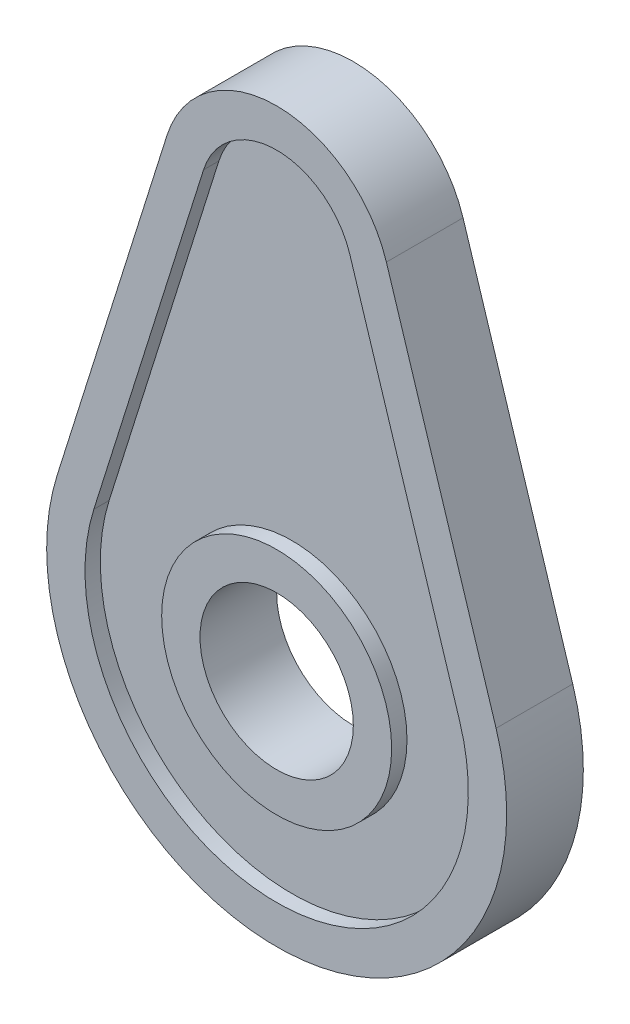
ISO-10303-21;
HEADER;
FILE_DESCRIPTION(('STEP AP214'),'2;1');
FILE_NAME('part.step','',(''),(''),'','','');
FILE_SCHEMA(('AUTOMOTIVE_DESIGN { 1 0 10303 214 1 1 1 1 }'));
ENDSEC;
DATA;
#1=APPLICATION_CONTEXT('core data for automotive mechanical design processes');
#2=APPLICATION_PROTOCOL_DEFINITION('international standard','automotive_design',2000,#1);
#3=PRODUCT_CONTEXT('',#1,'mechanical');
#4=PRODUCT('Part','Part','',(#3));
#5=PRODUCT_RELATED_PRODUCT_CATEGORY('part','',(#4));
#6=PRODUCT_DEFINITION_FORMATION('','',#4);
#7=PRODUCT_DEFINITION_CONTEXT('part definition',#1,'design');
#8=PRODUCT_DEFINITION('design','',#6,#7);
#9=PRODUCT_DEFINITION_SHAPE('','',#8);
#10=(LENGTH_UNIT() NAMED_UNIT(*) SI_UNIT(.MILLI.,.METRE.));
#11=(NAMED_UNIT(*) PLANE_ANGLE_UNIT() SI_UNIT($,.RADIAN.));
#12=(NAMED_UNIT(*) SI_UNIT($,.STERADIAN.) SOLID_ANGLE_UNIT());
#13=UNCERTAINTY_MEASURE_WITH_UNIT(LENGTH_MEASURE(1.E-05),#10,'distance_accuracy_value','');
#14=(GEOMETRIC_REPRESENTATION_CONTEXT(3) GLOBAL_UNCERTAINTY_ASSIGNED_CONTEXT((#13)) GLOBAL_UNIT_ASSIGNED_CONTEXT((#10,
#11,#12)) REPRESENTATION_CONTEXT('',''));
#15=CARTESIAN_POINT('',(0.,0.,0.));
#16=DIRECTION('',(0.,0.,1.));
#17=DIRECTION('',(1.,0.,0.));
#18=AXIS2_PLACEMENT_3D('',#15,#16,#17);
#19=CARTESIAN_POINT('',(0.,50.,2.));
#20=DIRECTION('',(0.,0.,-1.));
#21=DIRECTION('',(-1.,0.,0.));
#22=AXIS2_PLACEMENT_3D('',#19,#20,#21);
#23=PLANE('',#22);
#24=CARTESIAN_POINT('',(0.,50.,2.));
#25=DIRECTION('',(0.,0.,-1.));
#26=DIRECTION('',(-1.,0.,0.));
#27=AXIS2_PLACEMENT_3D('',#24,#25,#26);
#28=CIRCLE('',#27,9.99999999999999);
#29=CARTESIAN_POINT('',(-9.53939201416944,53.,2.));
#30=VERTEX_POINT('',#29);
#31=CARTESIAN_POINT('',(9.53939201416945,53.,2.));
#32=VERTEX_POINT('',#31);
#33=EDGE_CURVE('E131',#30,#32,#28,.T.);
#34=ORIENTED_EDGE('',*,*,#33,.T.);
#35=DIRECTION('',(0.3,-0.953939201416946,0.));
#36=VECTOR('',#35,1.);
#37=CARTESIAN_POINT('',(9.53939201416945,53.,2.));
#38=LINE('',#37,#36);
#39=CARTESIAN_POINT('',(23.8484800354236,7.50000000000001,2.));
#40=VERTEX_POINT('',#39);
#41=EDGE_CURVE('E141',#32,#40,#38,.T.);
#42=ORIENTED_EDGE('',*,*,#41,.T.);
#43=CARTESIAN_POINT('',(0.,0.,2.));
#44=DIRECTION('',(0.,0.,-1.));
#45=DIRECTION('',(-1.,0.,0.));
#46=AXIS2_PLACEMENT_3D('',#43,#44,#45);
#47=CIRCLE('',#46,25.);
#48=CARTESIAN_POINT('',(-23.8484800354236,7.50000000000001,2.));
#49=VERTEX_POINT('',#48);
#50=EDGE_CURVE('E147',#40,#49,#47,.T.);
#51=ORIENTED_EDGE('',*,*,#50,.T.);
#52=DIRECTION('',(0.3,0.953939201416946,0.));
#53=VECTOR('',#52,1.);
#54=CARTESIAN_POINT('',(-23.8484800354236,7.50000000000001,2.));
#55=LINE('',#54,#53);
#56=EDGE_CURVE('E138',#49,#30,#55,.T.);
#57=ORIENTED_EDGE('',*,*,#56,.T.);
#58=EDGE_LOOP('',(#34,#42,#51,#57));
#59=FACE_BOUND('',#58,.T.);
#60=CARTESIAN_POINT('',(0.,0.,2.));
#61=DIRECTION('',(0.,0.,-1.));
#62=DIRECTION('',(-1.,0.,0.));
#63=AXIS2_PLACEMENT_3D('',#60,#61,#62);
#64=CIRCLE('',#63,15.);
#65=CARTESIAN_POINT('',(-15.,0.,2.));
#66=VERTEX_POINT('',#65);
#67=EDGE_CURVE('E481',#66,#66,#64,.T.);
#68=ORIENTED_EDGE('',*,*,#67,.F.);
#69=EDGE_LOOP('',(#68));
#70=FACE_BOUND('',#69,.T.);
#71=ADVANCED_FACE('F39',(#59,#70),#23,.T.);
#72=CARTESIAN_POINT('',(0.,50.,10.));
#73=DIRECTION('',(0.,0.,-1.));
#74=DIRECTION('',(-1.,0.,0.));
#75=AXIS2_PLACEMENT_3D('',#72,#73,#74);
#76=CYLINDRICAL_SURFACE('',#75,15.);
#77=CARTESIAN_POINT('',(0.,50.,0.));
#78=DIRECTION('',(0.,0.,1.));
#79=DIRECTION('',(1.,0.,0.));
#80=AXIS2_PLACEMENT_3D('',#77,#78,#79);
#81=CIRCLE('',#80,15.);
#82=CARTESIAN_POINT('',(14.3090880212542,54.5,0.));
#83=VERTEX_POINT('',#82);
#84=CARTESIAN_POINT('',(-14.3090880212542,54.5,0.));
#85=VERTEX_POINT('',#84);
#86=EDGE_CURVE('E217',#83,#85,#81,.T.);
#87=ORIENTED_EDGE('',*,*,#86,.T.);
#88=DIRECTION('',(0.,0.,-1.));
#89=VECTOR('',#88,1.);
#90=CARTESIAN_POINT('',(-14.3090880212542,54.5,10.));
#91=LINE('',#90,#89);
#92=CARTESIAN_POINT('',(-14.3090880212542,54.5,10.));
#93=VERTEX_POINT('',#92);
#94=EDGE_CURVE('E11',#93,#85,#91,.T.);
#95=ORIENTED_EDGE('',*,*,#94,.F.);
#96=CARTESIAN_POINT('',(0.,50.,10.));
#97=DIRECTION('',(0.,0.,1.));
#98=DIRECTION('',(1.,0.,0.));
#99=AXIS2_PLACEMENT_3D('',#96,#97,#98);
#100=CIRCLE('',#99,15.);
#101=CARTESIAN_POINT('',(14.3090880212542,54.5,10.));
#102=VERTEX_POINT('',#101);
#103=EDGE_CURVE('E226',#102,#93,#100,.T.);
#104=ORIENTED_EDGE('',*,*,#103,.F.);
#105=DIRECTION('',(0.,0.,-1.));
#106=VECTOR('',#105,1.);
#107=CARTESIAN_POINT('',(14.3090880212542,54.5,10.));
#108=LINE('',#107,#106);
#109=EDGE_CURVE('E240',#102,#83,#108,.T.);
#110=ORIENTED_EDGE('',*,*,#109,.T.);
#111=EDGE_LOOP('',(#87,#95,#104,#110));
#112=FACE_BOUND('',#111,.T.);
#113=ADVANCED_FACE('F41',(#112),#76,.T.);
#114=CARTESIAN_POINT('',(-14.3090880212542,54.5,10.));
#115=DIRECTION('',(0.953939201416946,-0.3,0.));
#116=DIRECTION('',(0.3,0.953939201416946,0.));
#117=AXIS2_PLACEMENT_3D('',#114,#115,#116);
#118=PLANE('',#117);
#119=DIRECTION('',(-0.3,-0.953939201416946,0.));
#120=VECTOR('',#119,1.);
#121=CARTESIAN_POINT('',(-14.3090880212542,54.5,0.));
#122=LINE('',#121,#120);
#123=CARTESIAN_POINT('',(-28.6181760425084,9.,0.));
#124=VERTEX_POINT('',#123);
#125=EDGE_CURVE('E244',#85,#124,#122,.T.);
#126=ORIENTED_EDGE('',*,*,#125,.T.);
#127=DIRECTION('',(0.,0.,-1.));
#128=VECTOR('',#127,1.);
#129=CARTESIAN_POINT('',(-28.6181760425084,9.,10.));
#130=LINE('',#129,#128);
#131=CARTESIAN_POINT('',(-28.6181760425084,9.,10.));
#132=VERTEX_POINT('',#131);
#133=EDGE_CURVE('E48',#132,#124,#130,.T.);
#134=ORIENTED_EDGE('',*,*,#133,.F.);
#135=DIRECTION('',(-0.3,-0.953939201416946,0.));
#136=VECTOR('',#135,1.);
#137=CARTESIAN_POINT('',(-14.3090880212542,54.5,10.));
#138=LINE('',#137,#136);
#139=EDGE_CURVE('E230',#93,#132,#138,.T.);
#140=ORIENTED_EDGE('',*,*,#139,.F.);
#141=ORIENTED_EDGE('',*,*,#94,.T.);
#142=EDGE_LOOP('',(#126,#134,#140,#141));
#143=FACE_BOUND('',#142,.T.);
#144=ADVANCED_FACE('F280',(#143),#118,.F.);
#145=CARTESIAN_POINT('',(0.,0.,10.));
#146=DIRECTION('',(0.,0.,-1.));
#147=DIRECTION('',(-1.,0.,0.));
#148=AXIS2_PLACEMENT_3D('',#145,#146,#147);
#149=CYLINDRICAL_SURFACE('',#148,30.);
#150=CARTESIAN_POINT('',(0.,0.,0.));
#151=DIRECTION('',(0.,0.,1.));
#152=DIRECTION('',(1.,0.,0.));
#153=AXIS2_PLACEMENT_3D('',#150,#151,#152);
#154=CIRCLE('',#153,30.);
#155=CARTESIAN_POINT('',(28.6181760425084,9.,0.));
#156=VERTEX_POINT('',#155);
#157=EDGE_CURVE('E247',#124,#156,#154,.T.);
#158=ORIENTED_EDGE('',*,*,#157,.T.);
#159=DIRECTION('',(0.,0.,-1.));
#160=VECTOR('',#159,1.);
#161=CARTESIAN_POINT('',(28.6181760425084,9.,10.));
#162=LINE('',#161,#160);
#163=CARTESIAN_POINT('',(28.6181760425084,9.,10.));
#164=VERTEX_POINT('',#163);
#165=EDGE_CURVE('E255',#164,#156,#162,.T.);
#166=ORIENTED_EDGE('',*,*,#165,.F.);
#167=CARTESIAN_POINT('',(0.,0.,10.));
#168=DIRECTION('',(0.,0.,1.));
#169=DIRECTION('',(1.,0.,0.));
#170=AXIS2_PLACEMENT_3D('',#167,#168,#169);
#171=CIRCLE('',#170,30.);
#172=EDGE_CURVE('E234',#132,#164,#171,.T.);
#173=ORIENTED_EDGE('',*,*,#172,.F.);
#174=ORIENTED_EDGE('',*,*,#133,.T.);
#175=EDGE_LOOP('',(#158,#166,#173,#174));
#176=FACE_BOUND('',#175,.T.);
#177=ADVANCED_FACE('F264',(#176),#149,.T.);
#178=CARTESIAN_POINT('',(14.3090880212542,54.5,10.));
#179=DIRECTION('',(-0.953939201416946,-0.3,0.));
#180=DIRECTION('',(0.3,-0.953939201416946,0.));
#181=AXIS2_PLACEMENT_3D('',#178,#179,#180);
#182=PLANE('',#181);
#183=DIRECTION('',(-0.3,0.953939201416946,0.));
#184=VECTOR('',#183,1.);
#185=CARTESIAN_POINT('',(14.3090880212542,54.5,0.));
#186=LINE('',#185,#184);
#187=EDGE_CURVE('E231',#156,#83,#186,.T.);
#188=ORIENTED_EDGE('',*,*,#187,.T.);
#189=ORIENTED_EDGE('',*,*,#109,.F.);
#190=DIRECTION('',(-0.3,0.953939201416946,0.));
#191=VECTOR('',#190,1.);
#192=CARTESIAN_POINT('',(14.3090880212542,54.5,10.));
#193=LINE('',#192,#191);
#194=EDGE_CURVE('E237',#164,#102,#193,.T.);
#195=ORIENTED_EDGE('',*,*,#194,.F.);
#196=ORIENTED_EDGE('',*,*,#165,.T.);
#197=EDGE_LOOP('',(#188,#189,#195,#196));
#198=FACE_BOUND('',#197,.T.);
#199=ADVANCED_FACE('F273',(#198),#182,.F.);
#200=CARTESIAN_POINT('',(0.,50.,10.));
#201=DIRECTION('',(0.,0.,1.));
#202=DIRECTION('',(1.,0.,0.));
#203=AXIS2_PLACEMENT_3D('',#200,#201,#202);
#204=PLANE('',#203);
#205=CARTESIAN_POINT('',(0.,50.,10.));
#206=DIRECTION('',(0.,0.,1.));
#207=DIRECTION('',(1.,0.,0.));
#208=AXIS2_PLACEMENT_3D('',#205,#206,#207);
#209=CIRCLE('',#208,9.99999999999999);
#210=CARTESIAN_POINT('',(9.53939201416945,53.,10.));
#211=VERTEX_POINT('',#210);
#212=CARTESIAN_POINT('',(-9.53939201416944,53.,10.));
#213=VERTEX_POINT('',#212);
#214=EDGE_CURVE('E63',#211,#213,#209,.T.);
#215=ORIENTED_EDGE('',*,*,#214,.F.);
#216=DIRECTION('',(-0.3,0.953939201416946,0.));
#217=VECTOR('',#216,1.);
#218=CARTESIAN_POINT('',(23.8484800354236,7.50000000000001,10.));
#219=LINE('',#218,#217);
#220=CARTESIAN_POINT('',(23.8484800354236,7.50000000000001,10.));
#221=VERTEX_POINT('',#220);
#222=EDGE_CURVE('E188',#221,#211,#219,.T.);
#223=ORIENTED_EDGE('',*,*,#222,.F.);
#224=CARTESIAN_POINT('',(0.,0.,10.));
#225=DIRECTION('',(0.,0.,1.));
#226=DIRECTION('',(1.,0.,0.));
#227=AXIS2_PLACEMENT_3D('',#224,#225,#226);
#228=CIRCLE('',#227,25.);
#229=CARTESIAN_POINT('',(-23.8484800354236,7.5,10.));
#230=VERTEX_POINT('',#229);
#231=EDGE_CURVE('E207',#230,#221,#228,.T.);
#232=ORIENTED_EDGE('',*,*,#231,.F.);
#233=DIRECTION('',(-0.3,-0.953939201416946,0.));
#234=VECTOR('',#233,1.);
#235=CARTESIAN_POINT('',(-9.53939201416944,53.,10.));
#236=LINE('',#235,#234);
#237=EDGE_CURVE('E203',#213,#230,#236,.T.);
#238=ORIENTED_EDGE('',*,*,#237,.F.);
#239=EDGE_LOOP('',(#215,#223,#232,#238));
#240=FACE_BOUND('',#239,.T.);
#241=ORIENTED_EDGE('',*,*,#103,.T.);
#242=ORIENTED_EDGE('',*,*,#139,.T.);
#243=ORIENTED_EDGE('',*,*,#172,.T.);
#244=ORIENTED_EDGE('',*,*,#194,.T.);
#245=EDGE_LOOP('',(#241,#242,#243,#244));
#246=FACE_BOUND('',#245,.T.);
#247=ADVANCED_FACE('F279',(#240,#246),#204,.T.);
#248=CARTESIAN_POINT('',(0.,50.,0.));
#249=DIRECTION('',(0.,0.,1.));
#250=DIRECTION('',(1.,0.,0.));
#251=AXIS2_PLACEMENT_3D('',#248,#249,#250);
#252=PLANE('',#251);
#253=DIRECTION('',(0.3,-0.953939201416946,0.));
#254=VECTOR('',#253,1.);
#255=CARTESIAN_POINT('',(9.53939201416945,53.,0.));
#256=LINE('',#255,#254);
#257=CARTESIAN_POINT('',(9.53939201416945,53.,0.));
#258=VERTEX_POINT('',#257);
#259=CARTESIAN_POINT('',(23.8484800354236,7.50000000000001,0.));
#260=VERTEX_POINT('',#259);
#261=EDGE_CURVE('E168',#258,#260,#256,.T.);
#262=ORIENTED_EDGE('',*,*,#261,.F.);
#263=CARTESIAN_POINT('',(0.,50.,0.));
#264=DIRECTION('',(0.,0.,-1.));
#265=DIRECTION('',(-1.,0.,0.));
#266=AXIS2_PLACEMENT_3D('',#263,#264,#265);
#267=CIRCLE('',#266,9.99999999999999);
#268=CARTESIAN_POINT('',(-9.53939201416944,53.,0.));
#269=VERTEX_POINT('',#268);
#270=EDGE_CURVE('E55',#269,#258,#267,.T.);
#271=ORIENTED_EDGE('',*,*,#270,.F.);
#272=DIRECTION('',(0.3,0.953939201416946,0.));
#273=VECTOR('',#272,1.);
#274=CARTESIAN_POINT('',(-23.8484800354236,7.50000000000001,0.));
#275=LINE('',#274,#273);
#276=CARTESIAN_POINT('',(-23.8484800354236,7.50000000000001,0.));
#277=VERTEX_POINT('',#276);
#278=EDGE_CURVE('E152',#277,#269,#275,.T.);
#279=ORIENTED_EDGE('',*,*,#278,.F.);
#280=CARTESIAN_POINT('',(0.,0.,0.));
#281=DIRECTION('',(0.,0.,-1.));
#282=DIRECTION('',(-1.,0.,0.));
#283=AXIS2_PLACEMENT_3D('',#280,#281,#282);
#284=CIRCLE('',#283,25.);
#285=EDGE_CURVE('E156',#260,#277,#284,.T.);
#286=ORIENTED_EDGE('',*,*,#285,.F.);
#287=EDGE_LOOP('',(#262,#271,#279,#286));
#288=FACE_BOUND('',#287,.T.);
#289=ORIENTED_EDGE('',*,*,#86,.F.);
#290=ORIENTED_EDGE('',*,*,#187,.F.);
#291=ORIENTED_EDGE('',*,*,#157,.F.);
#292=ORIENTED_EDGE('',*,*,#125,.F.);
#293=EDGE_LOOP('',(#289,#290,#291,#292));
#294=FACE_BOUND('',#293,.T.);
#295=ADVANCED_FACE('F270',(#288,#294),#252,.F.);
#296=CARTESIAN_POINT('',(0.,50.,8.));
#297=DIRECTION('',(0.,0.,1.));
#298=DIRECTION('',(1.,0.,0.));
#299=AXIS2_PLACEMENT_3D('',#296,#297,#298);
#300=CYLINDRICAL_SURFACE('',#299,9.99999999999999);
#301=ORIENTED_EDGE('',*,*,#214,.T.);
#302=DIRECTION('',(0.,0.,1.));
#303=VECTOR('',#302,1.);
#304=CARTESIAN_POINT('',(-9.53939201416944,53.,8.));
#305=LINE('',#304,#303);
#306=CARTESIAN_POINT('',(-9.53939201416944,53.,8.));
#307=VERTEX_POINT('',#306);
#308=EDGE_CURVE('E200',#307,#213,#305,.T.);
#309=ORIENTED_EDGE('',*,*,#308,.F.);
#310=CARTESIAN_POINT('',(0.,50.,8.));
#311=DIRECTION('',(0.,0.,1.));
#312=DIRECTION('',(1.,0.,0.));
#313=AXIS2_PLACEMENT_3D('',#310,#311,#312);
#314=CIRCLE('',#313,9.99999999999999);
#315=CARTESIAN_POINT('',(9.53939201416945,53.,8.));
#316=VERTEX_POINT('',#315);
#317=EDGE_CURVE('E183',#316,#307,#314,.T.);
#318=ORIENTED_EDGE('',*,*,#317,.F.);
#319=DIRECTION('',(0.,0.,1.));
#320=VECTOR('',#319,1.);
#321=CARTESIAN_POINT('',(9.53939201416945,53.,8.));
#322=LINE('',#321,#320);
#323=EDGE_CURVE('E214',#316,#211,#322,.T.);
#324=ORIENTED_EDGE('',*,*,#323,.T.);
#325=EDGE_LOOP('',(#301,#309,#318,#324));
#326=FACE_BOUND('',#325,.T.);
#327=ADVANCED_FACE('F316',(#326),#300,.F.);
#328=CARTESIAN_POINT('',(23.8484800354236,7.50000000000001,8.));
#329=DIRECTION('',(0.953939201416946,0.3,0.));
#330=DIRECTION('',(-0.3,0.953939201416946,0.));
#331=AXIS2_PLACEMENT_3D('',#328,#329,#330);
#332=PLANE('',#331);
#333=ORIENTED_EDGE('',*,*,#222,.T.);
#334=ORIENTED_EDGE('',*,*,#323,.F.);
#335=DIRECTION('',(-0.3,0.953939201416946,0.));
#336=VECTOR('',#335,1.);
#337=CARTESIAN_POINT('',(23.8484800354236,7.50000000000001,8.));
#338=LINE('',#337,#336);
#339=CARTESIAN_POINT('',(23.8484800354236,7.50000000000001,8.));
#340=VERTEX_POINT('',#339);
#341=EDGE_CURVE('E196',#340,#316,#338,.T.);
#342=ORIENTED_EDGE('',*,*,#341,.F.);
#343=DIRECTION('',(0.,0.,1.));
#344=VECTOR('',#343,1.);
#345=CARTESIAN_POINT('',(23.8484800354236,7.50000000000001,8.));
#346=LINE('',#345,#344);
#347=EDGE_CURVE('E218',#340,#221,#346,.T.);
#348=ORIENTED_EDGE('',*,*,#347,.T.);
#349=EDGE_LOOP('',(#333,#334,#342,#348));
#350=FACE_BOUND('',#349,.T.);
#351=ADVANCED_FACE('F312',(#350),#332,.F.);
#352=CARTESIAN_POINT('',(0.,0.,8.));
#353=DIRECTION('',(0.,0.,1.));
#354=DIRECTION('',(1.,0.,0.));
#355=AXIS2_PLACEMENT_3D('',#352,#353,#354);
#356=CYLINDRICAL_SURFACE('',#355,25.);
#357=ORIENTED_EDGE('',*,*,#231,.T.);
#358=ORIENTED_EDGE('',*,*,#347,.F.);
#359=CARTESIAN_POINT('',(0.,0.,8.));
#360=DIRECTION('',(0.,0.,1.));
#361=DIRECTION('',(1.,0.,0.));
#362=AXIS2_PLACEMENT_3D('',#359,#360,#361);
#363=CIRCLE('',#362,25.);
#364=CARTESIAN_POINT('',(-23.8484800354236,7.5,8.));
#365=VERTEX_POINT('',#364);
#366=EDGE_CURVE('E192',#365,#340,#363,.T.);
#367=ORIENTED_EDGE('',*,*,#366,.F.);
#368=DIRECTION('',(0.,0.,1.));
#369=VECTOR('',#368,1.);
#370=CARTESIAN_POINT('',(-23.8484800354236,7.5,8.));
#371=LINE('',#370,#369);
#372=EDGE_CURVE('E221',#365,#230,#371,.T.);
#373=ORIENTED_EDGE('',*,*,#372,.T.);
#374=EDGE_LOOP('',(#357,#358,#367,#373));
#375=FACE_BOUND('',#374,.T.);
#376=ADVANCED_FACE('F315',(#375),#356,.F.);
#377=CARTESIAN_POINT('',(-9.53939201416944,53.,8.));
#378=DIRECTION('',(-0.953939201416946,0.3,0.));
#379=DIRECTION('',(-0.3,-0.953939201416946,0.));
#380=AXIS2_PLACEMENT_3D('',#377,#378,#379);
#381=PLANE('',#380);
#382=ORIENTED_EDGE('',*,*,#237,.T.);
#383=ORIENTED_EDGE('',*,*,#372,.F.);
#384=DIRECTION('',(-0.3,-0.953939201416946,0.));
#385=VECTOR('',#384,1.);
#386=CARTESIAN_POINT('',(-9.53939201416944,53.,8.));
#387=LINE('',#386,#385);
#388=EDGE_CURVE('E187',#307,#365,#387,.T.);
#389=ORIENTED_EDGE('',*,*,#388,.F.);
#390=ORIENTED_EDGE('',*,*,#308,.T.);
#391=EDGE_LOOP('',(#382,#383,#389,#390));
#392=FACE_BOUND('',#391,.T.);
#393=ADVANCED_FACE('F310',(#392),#381,.F.);
#394=CARTESIAN_POINT('',(0.,50.,8.));
#395=DIRECTION('',(0.,0.,1.));
#396=DIRECTION('',(1.,0.,0.));
#397=AXIS2_PLACEMENT_3D('',#394,#395,#396);
#398=PLANE('',#397);
#399=CARTESIAN_POINT('',(0.,-0.1090303175917,8.));
#400=DIRECTION('',(0.,0.,1.));
#401=DIRECTION('',(1.,0.,0.));
#402=AXIS2_PLACEMENT_3D('',#399,#400,#401);
#403=CIRCLE('',#402,15.);
#404=CARTESIAN_POINT('',(15.,-0.1090303175917,8.));
#405=VERTEX_POINT('',#404);
#406=EDGE_CURVE('E159',#405,#405,#403,.T.);
#407=ORIENTED_EDGE('',*,*,#406,.F.);
#408=EDGE_LOOP('',(#407));
#409=FACE_BOUND('',#408,.T.);
#410=ORIENTED_EDGE('',*,*,#317,.T.);
#411=ORIENTED_EDGE('',*,*,#388,.T.);
#412=ORIENTED_EDGE('',*,*,#366,.T.);
#413=ORIENTED_EDGE('',*,*,#341,.T.);
#414=EDGE_LOOP('',(#410,#411,#412,#413));
#415=FACE_BOUND('',#414,.T.);
#416=ADVANCED_FACE('F307',(#409,#415),#398,.T.);
#417=CARTESIAN_POINT('',(0.,50.,2.));
#418=DIRECTION('',(0.,0.,-1.));
#419=DIRECTION('',(-1.,0.,0.));
#420=AXIS2_PLACEMENT_3D('',#417,#418,#419);
#421=CYLINDRICAL_SURFACE('',#420,9.99999999999999);
#422=ORIENTED_EDGE('',*,*,#270,.T.);
#423=DIRECTION('',(0.,0.,-1.));
#424=VECTOR('',#423,1.);
#425=CARTESIAN_POINT('',(9.53939201416945,53.,2.));
#426=LINE('',#425,#424);
#427=EDGE_CURVE('E127',#32,#258,#426,.T.);
#428=ORIENTED_EDGE('',*,*,#427,.F.);
#429=ORIENTED_EDGE('',*,*,#33,.F.);
#430=DIRECTION('',(0.,0.,-1.));
#431=VECTOR('',#430,1.);
#432=CARTESIAN_POINT('',(-9.53939201416944,53.,2.));
#433=LINE('',#432,#431);
#434=EDGE_CURVE('E175',#30,#269,#433,.T.);
#435=ORIENTED_EDGE('',*,*,#434,.T.);
#436=EDGE_LOOP('',(#422,#428,#429,#435));
#437=FACE_BOUND('',#436,.T.);
#438=ADVANCED_FACE('F129',(#437),#421,.F.);
#439=CARTESIAN_POINT('',(-23.8484800354236,7.50000000000001,2.));
#440=DIRECTION('',(-0.953939201416946,0.3,0.));
#441=DIRECTION('',(-0.3,-0.953939201416946,0.));
#442=AXIS2_PLACEMENT_3D('',#439,#440,#441);
#443=PLANE('',#442);
#444=ORIENTED_EDGE('',*,*,#278,.T.);
#445=ORIENTED_EDGE('',*,*,#434,.F.);
#446=ORIENTED_EDGE('',*,*,#56,.F.);
#447=DIRECTION('',(0.,0.,-1.));
#448=VECTOR('',#447,1.);
#449=CARTESIAN_POINT('',(-23.8484800354236,7.50000000000001,2.));
#450=LINE('',#449,#448);
#451=EDGE_CURVE('E178',#49,#277,#450,.T.);
#452=ORIENTED_EDGE('',*,*,#451,.T.);
#453=EDGE_LOOP('',(#444,#445,#446,#452));
#454=FACE_BOUND('',#453,.T.);
#455=ADVANCED_FACE('F295',(#454),#443,.F.);
#456=CARTESIAN_POINT('',(0.,0.,2.));
#457=DIRECTION('',(0.,0.,-1.));
#458=DIRECTION('',(-1.,0.,0.));
#459=AXIS2_PLACEMENT_3D('',#456,#457,#458);
#460=CYLINDRICAL_SURFACE('',#459,25.);
#461=ORIENTED_EDGE('',*,*,#285,.T.);
#462=ORIENTED_EDGE('',*,*,#451,.F.);
#463=ORIENTED_EDGE('',*,*,#50,.F.);
#464=DIRECTION('',(0.,0.,-1.));
#465=VECTOR('',#464,1.);
#466=CARTESIAN_POINT('',(23.8484800354236,7.50000000000001,2.));
#467=LINE('',#466,#465);
#468=EDGE_CURVE('E137',#40,#260,#467,.T.);
#469=ORIENTED_EDGE('',*,*,#468,.T.);
#470=EDGE_LOOP('',(#461,#462,#463,#469));
#471=FACE_BOUND('',#470,.T.);
#472=ADVANCED_FACE('F298',(#471),#460,.F.);
#473=CARTESIAN_POINT('',(9.53939201416945,53.,2.));
#474=DIRECTION('',(0.953939201416946,0.3,0.));
#475=DIRECTION('',(-0.3,0.953939201416946,0.));
#476=AXIS2_PLACEMENT_3D('',#473,#474,#475);
#477=PLANE('',#476);
#478=ORIENTED_EDGE('',*,*,#261,.T.);
#479=ORIENTED_EDGE('',*,*,#468,.F.);
#480=ORIENTED_EDGE('',*,*,#41,.F.);
#481=ORIENTED_EDGE('',*,*,#427,.T.);
#482=EDGE_LOOP('',(#478,#479,#480,#481));
#483=FACE_BOUND('',#482,.T.);
#484=ADVANCED_FACE('F142',(#483),#477,.F.);
#485=CARTESIAN_POINT('',(0.,-0.1090303175917,10.));
#486=DIRECTION('',(0.,0.,-1.));
#487=DIRECTION('',(-1.,0.,0.));
#488=AXIS2_PLACEMENT_3D('',#485,#486,#487);
#489=CYLINDRICAL_SURFACE('',#488,15.);
#490=CARTESIAN_POINT('',(0.,-0.1090303175917,10.));
#491=DIRECTION('',(0.,0.,1.));
#492=DIRECTION('',(1.,0.,0.));
#493=AXIS2_PLACEMENT_3D('',#490,#491,#492);
#494=CIRCLE('',#493,15.);
#495=CARTESIAN_POINT('',(15.,-0.1090303175917,10.));
#496=VERTEX_POINT('',#495);
#497=EDGE_CURVE('E169',#496,#496,#494,.T.);
#498=ORIENTED_EDGE('',*,*,#497,.F.);
#499=EDGE_LOOP('',(#498));
#500=FACE_BOUND('',#499,.T.);
#501=ORIENTED_EDGE('',*,*,#406,.T.);
#502=EDGE_LOOP('',(#501));
#503=FACE_BOUND('',#502,.T.);
#504=ADVANCED_FACE('F293',(#500,#503),#489,.T.);
#505=CARTESIAN_POINT('',(0.,-0.1090303175917,10.));
#506=DIRECTION('',(0.,0.,1.));
#507=DIRECTION('',(1.,0.,0.));
#508=AXIS2_PLACEMENT_3D('',#505,#506,#507);
#509=PLANE('',#508);
#510=CARTESIAN_POINT('',(0.,0.,10.));
#511=DIRECTION('',(0.,0.,1.));
#512=DIRECTION('',(1.,0.,0.));
#513=AXIS2_PLACEMENT_3D('',#510,#511,#512);
#514=CIRCLE('',#513,10.);
#515=CARTESIAN_POINT('',(10.,0.,10.));
#516=VERTEX_POINT('',#515);
#517=EDGE_CURVE('E487',#516,#516,#514,.T.);
#518=ORIENTED_EDGE('',*,*,#517,.F.);
#519=EDGE_LOOP('',(#518));
#520=FACE_BOUND('',#519,.T.);
#521=ORIENTED_EDGE('',*,*,#497,.T.);
#522=EDGE_LOOP('',(#521));
#523=FACE_BOUND('',#522,.T.);
#524=ADVANCED_FACE('F387',(#520,#523),#509,.T.);
#525=CARTESIAN_POINT('',(0.,0.,0.));
#526=DIRECTION('',(0.,0.,1.));
#527=DIRECTION('',(1.,0.,0.));
#528=AXIS2_PLACEMENT_3D('',#525,#526,#527);
#529=CYLINDRICAL_SURFACE('',#528,10.);
#530=ORIENTED_EDGE('',*,*,#517,.T.);
#531=EDGE_LOOP('',(#530));
#532=FACE_BOUND('',#531,.T.);
#533=CARTESIAN_POINT('',(0.,0.,0.));
#534=DIRECTION('',(0.,0.,-1.));
#535=DIRECTION('',(-1.,0.,0.));
#536=AXIS2_PLACEMENT_3D('',#533,#534,#535);
#537=CIRCLE('',#536,10.);
#538=CARTESIAN_POINT('',(-10.,0.,0.));
#539=VERTEX_POINT('',#538);
#540=EDGE_CURVE('E483',#539,#539,#537,.T.);
#541=ORIENTED_EDGE('',*,*,#540,.T.);
#542=EDGE_LOOP('',(#541));
#543=FACE_BOUND('',#542,.T.);
#544=ADVANCED_FACE('F394',(#532,#543),#529,.F.);
#545=CARTESIAN_POINT('',(0.,0.,0.));
#546=DIRECTION('',(0.,0.,-1.));
#547=DIRECTION('',(-1.,0.,0.));
#548=AXIS2_PLACEMENT_3D('',#545,#546,#547);
#549=PLANE('',#548);
#550=CARTESIAN_POINT('',(0.,0.,0.));
#551=DIRECTION('',(0.,0.,-1.));
#552=DIRECTION('',(-1.,0.,0.));
#553=AXIS2_PLACEMENT_3D('',#550,#551,#552);
#554=CIRCLE('',#553,15.);
#555=CARTESIAN_POINT('',(-15.,0.,0.));
#556=VERTEX_POINT('',#555);
#557=EDGE_CURVE('E478',#556,#556,#554,.T.);
#558=ORIENTED_EDGE('',*,*,#557,.T.);
#559=EDGE_LOOP('',(#558));
#560=FACE_BOUND('',#559,.T.);
#561=ORIENTED_EDGE('',*,*,#540,.F.);
#562=EDGE_LOOP('',(#561));
#563=FACE_BOUND('',#562,.T.);
#564=ADVANCED_FACE('F401',(#560,#563),#549,.T.);
#565=CARTESIAN_POINT('',(0.,0.,0.));
#566=DIRECTION('',(0.,0.,1.));
#567=DIRECTION('',(1.,0.,0.));
#568=AXIS2_PLACEMENT_3D('',#565,#566,#567);
#569=CYLINDRICAL_SURFACE('',#568,15.);
#570=ORIENTED_EDGE('',*,*,#557,.F.);
#571=EDGE_LOOP('',(#570));
#572=FACE_BOUND('',#571,.T.);
#573=ORIENTED_EDGE('',*,*,#67,.T.);
#574=EDGE_LOOP('',(#573));
#575=FACE_BOUND('',#574,.T.);
#576=ADVANCED_FACE('F409',(#572,#575),#569,.T.);
#577=CLOSED_SHELL('',(#71,#113,#144,#177,#199,#247,#295,#327,#351,#376,#393,#416,#438,#455,#472,
#484,#504,#524,#544,#564,#576));
#578=MANIFOLD_SOLID_BREP('B2',#577);
#579=ADVANCED_BREP_SHAPE_REPRESENTATION('',(#18,#578),#14);
#580=SHAPE_DEFINITION_REPRESENTATION(#9,#579);
ENDSEC;
END-ISO-10303-21;
